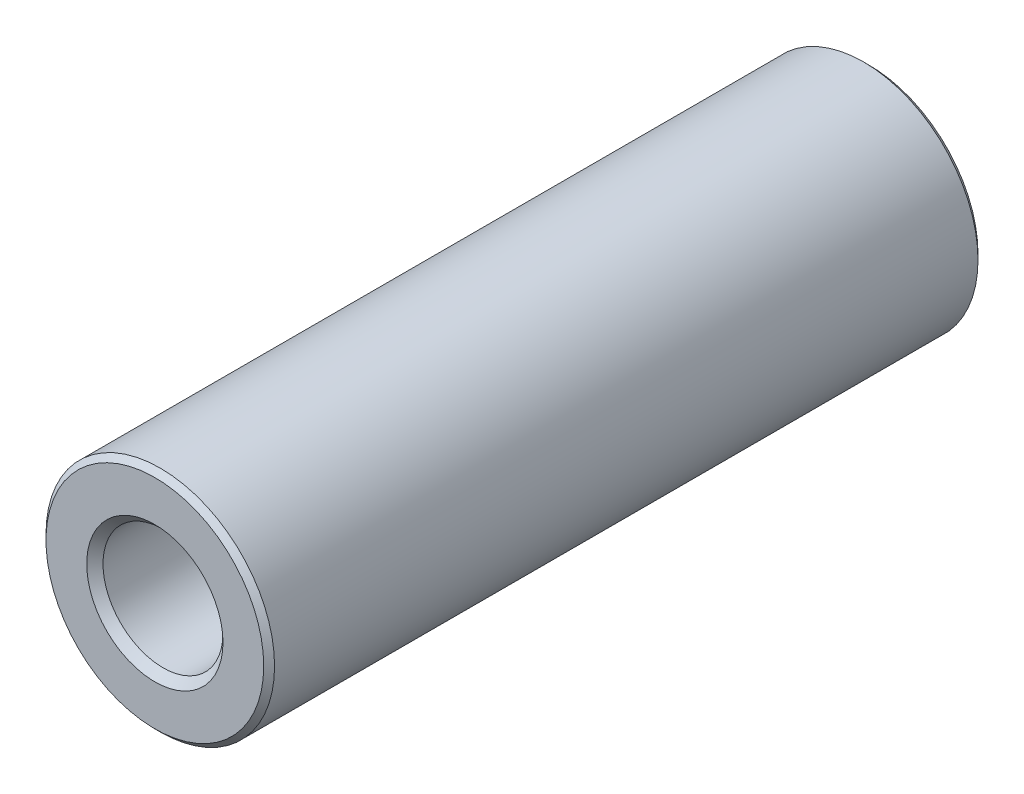
ISO-10303-21;
HEADER;
FILE_DESCRIPTION(('STEP AP214'),'2;1');
FILE_NAME('part.step','',(''),(''),'','','');
FILE_SCHEMA(('AUTOMOTIVE_DESIGN { 1 0 10303 214 1 1 1 1 }'));
ENDSEC;
DATA;
#1=APPLICATION_CONTEXT('core data for automotive mechanical design processes');
#2=APPLICATION_PROTOCOL_DEFINITION('international standard','automotive_design',2000,#1);
#3=PRODUCT_CONTEXT('',#1,'mechanical');
#4=PRODUCT('Part','Part','',(#3));
#5=PRODUCT_RELATED_PRODUCT_CATEGORY('part','',(#4));
#6=PRODUCT_DEFINITION_FORMATION('','',#4);
#7=PRODUCT_DEFINITION_CONTEXT('part definition',#1,'design');
#8=PRODUCT_DEFINITION('design','',#6,#7);
#9=PRODUCT_DEFINITION_SHAPE('','',#8);
#10=(LENGTH_UNIT() NAMED_UNIT(*) SI_UNIT(.MILLI.,.METRE.));
#11=(NAMED_UNIT(*) PLANE_ANGLE_UNIT() SI_UNIT($,.RADIAN.));
#12=(NAMED_UNIT(*) SI_UNIT($,.STERADIAN.) SOLID_ANGLE_UNIT());
#13=UNCERTAINTY_MEASURE_WITH_UNIT(LENGTH_MEASURE(1.E-05),#10,'distance_accuracy_value','');
#14=(GEOMETRIC_REPRESENTATION_CONTEXT(3) GLOBAL_UNCERTAINTY_ASSIGNED_CONTEXT((#13)) GLOBAL_UNIT_ASSIGNED_CONTEXT((#10,
#11,#12)) REPRESENTATION_CONTEXT('',''));
#15=CARTESIAN_POINT('',(0.,0.,0.));
#16=DIRECTION('',(0.,0.,1.));
#17=DIRECTION('',(1.,0.,0.));
#18=AXIS2_PLACEMENT_3D('',#15,#16,#17);
#19=CARTESIAN_POINT('',(0.,0.,-12.5));
#20=DIRECTION('',(0.,0.,1.));
#21=DIRECTION('',(1.,0.,0.));
#22=AXIS2_PLACEMENT_3D('',#19,#20,#21);
#23=CYLINDRICAL_SURFACE('',#22,4.);
#24=CARTESIAN_POINT('',(0.,0.,12.31));
#25=DIRECTION('',(0.,0.,1.));
#26=DIRECTION('',(1.,0.,0.));
#27=AXIS2_PLACEMENT_3D('',#24,#25,#26);
#28=CIRCLE('',#27,4.);
#29=CARTESIAN_POINT('',(4.,0.,12.31));
#30=VERTEX_POINT('',#29);
#31=EDGE_CURVE('E69',#30,#30,#28,.F.);
#32=ORIENTED_EDGE('',*,*,#31,.T.);
#33=EDGE_LOOP('',(#32));
#34=FACE_BOUND('',#33,.T.);
#35=CARTESIAN_POINT('',(0.,0.,-12.31));
#36=DIRECTION('',(0.,0.,1.));
#37=DIRECTION('',(1.,0.,0.));
#38=AXIS2_PLACEMENT_3D('',#35,#36,#37);
#39=CIRCLE('',#38,4.);
#40=CARTESIAN_POINT('',(4.,0.,-12.31));
#41=VERTEX_POINT('',#40);
#42=EDGE_CURVE('E73',#41,#41,#39,.T.);
#43=ORIENTED_EDGE('',*,*,#42,.T.);
#44=EDGE_LOOP('',(#43));
#45=FACE_BOUND('',#44,.T.);
#46=ADVANCED_FACE('F39',(#34,#45),#23,.T.);
#47=CARTESIAN_POINT('',(0.,0.,-12.5));
#48=DIRECTION('',(0.,0.,1.));
#49=DIRECTION('',(1.,0.,0.));
#50=AXIS2_PLACEMENT_3D('',#47,#48,#49);
#51=PLANE('',#50);
#52=CARTESIAN_POINT('',(0.,0.,-12.5));
#53=DIRECTION('',(0.,0.,1.));
#54=DIRECTION('',(1.,0.,0.));
#55=AXIS2_PLACEMENT_3D('',#52,#53,#54);
#56=CIRCLE('',#55,2.385);
#57=CARTESIAN_POINT('',(2.385,0.,-12.5));
#58=VERTEX_POINT('',#57);
#59=EDGE_CURVE('E10',#58,#58,#56,.T.);
#60=ORIENTED_EDGE('',*,*,#59,.T.);
#61=EDGE_LOOP('',(#60));
#62=FACE_BOUND('',#61,.T.);
#63=CARTESIAN_POINT('',(0.,0.,-12.5));
#64=DIRECTION('',(0.,0.,1.));
#65=DIRECTION('',(1.,0.,0.));
#66=AXIS2_PLACEMENT_3D('',#63,#64,#65);
#67=CIRCLE('',#66,3.81000000000001);
#68=CARTESIAN_POINT('',(3.81000000000001,0.,-12.5));
#69=VERTEX_POINT('',#68);
#70=EDGE_CURVE('E65',#69,#69,#67,.F.);
#71=ORIENTED_EDGE('',*,*,#70,.T.);
#72=EDGE_LOOP('',(#71));
#73=FACE_BOUND('',#72,.T.);
#74=ADVANCED_FACE('F102',(#62,#73),#51,.F.);
#75=CARTESIAN_POINT('',(0.,0.,-12.5));
#76=DIRECTION('',(0.,0.,1.));
#77=DIRECTION('',(1.,0.,0.));
#78=AXIS2_PLACEMENT_3D('',#75,#76,#77);
#79=CYLINDRICAL_SURFACE('',#78,2.1);
#80=CARTESIAN_POINT('',(0.,0.,12.215));
#81=DIRECTION('',(0.,0.,1.));
#82=DIRECTION('',(1.,0.,0.));
#83=AXIS2_PLACEMENT_3D('',#80,#81,#82);
#84=CIRCLE('',#83,2.1);
#85=CARTESIAN_POINT('',(2.1,0.,12.215));
#86=VERTEX_POINT('',#85);
#87=EDGE_CURVE('E53',#86,#86,#84,.T.);
#88=ORIENTED_EDGE('',*,*,#87,.T.);
#89=EDGE_LOOP('',(#88));
#90=FACE_BOUND('',#89,.T.);
#91=CARTESIAN_POINT('',(0.,0.,-12.215));
#92=DIRECTION('',(0.,0.,1.));
#93=DIRECTION('',(1.,0.,0.));
#94=AXIS2_PLACEMENT_3D('',#91,#92,#93);
#95=CIRCLE('',#94,2.1);
#96=CARTESIAN_POINT('',(2.1,0.,-12.215));
#97=VERTEX_POINT('',#96);
#98=EDGE_CURVE('E59',#97,#97,#95,.F.);
#99=ORIENTED_EDGE('',*,*,#98,.T.);
#100=EDGE_LOOP('',(#99));
#101=FACE_BOUND('',#100,.T.);
#102=ADVANCED_FACE('F97',(#90,#101),#79,.F.);
#103=CARTESIAN_POINT('',(0.,0.,12.5));
#104=DIRECTION('',(0.,0.,1.));
#105=DIRECTION('',(1.,0.,0.));
#106=AXIS2_PLACEMENT_3D('',#103,#104,#105);
#107=PLANE('',#106);
#108=CARTESIAN_POINT('',(0.,0.,12.5));
#109=DIRECTION('',(0.,0.,1.));
#110=DIRECTION('',(1.,0.,0.));
#111=AXIS2_PLACEMENT_3D('',#108,#109,#110);
#112=CIRCLE('',#111,2.385);
#113=CARTESIAN_POINT('',(2.385,0.,12.5));
#114=VERTEX_POINT('',#113);
#115=EDGE_CURVE('E47',#114,#114,#112,.F.);
#116=ORIENTED_EDGE('',*,*,#115,.T.);
#117=EDGE_LOOP('',(#116));
#118=FACE_BOUND('',#117,.T.);
#119=CARTESIAN_POINT('',(0.,0.,12.5));
#120=DIRECTION('',(0.,0.,1.));
#121=DIRECTION('',(1.,0.,0.));
#122=AXIS2_PLACEMENT_3D('',#119,#120,#121);
#123=CIRCLE('',#122,3.81);
#124=CARTESIAN_POINT('',(3.81,0.,12.5));
#125=VERTEX_POINT('',#124);
#126=EDGE_CURVE('E77',#125,#125,#123,.T.);
#127=ORIENTED_EDGE('',*,*,#126,.T.);
#128=EDGE_LOOP('',(#127));
#129=FACE_BOUND('',#128,.T.);
#130=ADVANCED_FACE('F83',(#118,#129),#107,.T.);
#131=CARTESIAN_POINT('',(0.,0.,12.5));
#132=DIRECTION('',(0.,0.,-1.));
#133=DIRECTION('',(-1.,0.,0.));
#134=AXIS2_PLACEMENT_3D('',#131,#132,#133);
#135=CONICAL_SURFACE('',#134,3.81,0.785398163397448);
#136=ORIENTED_EDGE('',*,*,#31,.F.);
#137=EDGE_LOOP('',(#136));
#138=FACE_BOUND('',#137,.T.);
#139=ORIENTED_EDGE('',*,*,#126,.F.);
#140=EDGE_LOOP('',(#139));
#141=FACE_BOUND('',#140,.T.);
#142=ADVANCED_FACE('F85',(#138,#141),#135,.T.);
#143=CARTESIAN_POINT('',(0.,0.,-12.31));
#144=DIRECTION('',(0.,0.,1.));
#145=DIRECTION('',(1.,0.,0.));
#146=AXIS2_PLACEMENT_3D('',#143,#144,#145);
#147=CONICAL_SURFACE('',#146,4.,0.785398163397444);
#148=ORIENTED_EDGE('',*,*,#70,.F.);
#149=EDGE_LOOP('',(#148));
#150=FACE_BOUND('',#149,.T.);
#151=ORIENTED_EDGE('',*,*,#42,.F.);
#152=EDGE_LOOP('',(#151));
#153=FACE_BOUND('',#152,.T.);
#154=ADVANCED_FACE('F87',(#150,#153),#147,.T.);
#155=CARTESIAN_POINT('',(0.,0.,12.215));
#156=DIRECTION('',(0.,0.,1.));
#157=DIRECTION('',(1.,0.,0.));
#158=AXIS2_PLACEMENT_3D('',#155,#156,#157);
#159=CONICAL_SURFACE('',#158,2.1,0.78539816339745);
#160=ORIENTED_EDGE('',*,*,#115,.F.);
#161=EDGE_LOOP('',(#160));
#162=FACE_BOUND('',#161,.T.);
#163=ORIENTED_EDGE('',*,*,#87,.F.);
#164=EDGE_LOOP('',(#163));
#165=FACE_BOUND('',#164,.T.);
#166=ADVANCED_FACE('F94',(#162,#165),#159,.F.);
#167=CARTESIAN_POINT('',(0.,0.,-12.5));
#168=DIRECTION('',(0.,0.,-1.));
#169=DIRECTION('',(-1.,0.,0.));
#170=AXIS2_PLACEMENT_3D('',#167,#168,#169);
#171=CONICAL_SURFACE('',#170,2.385,0.785398163397444);
#172=ORIENTED_EDGE('',*,*,#98,.F.);
#173=EDGE_LOOP('',(#172));
#174=FACE_BOUND('',#173,.T.);
#175=ORIENTED_EDGE('',*,*,#59,.F.);
#176=EDGE_LOOP('',(#175));
#177=FACE_BOUND('',#176,.T.);
#178=ADVANCED_FACE('F41',(#174,#177),#171,.F.);
#179=CLOSED_SHELL('',(#46,#74,#102,#130,#142,#154,#166,#178));
#180=MANIFOLD_SOLID_BREP('B2',#179);
#181=ADVANCED_BREP_SHAPE_REPRESENTATION('',(#18,#180),#14);
#182=SHAPE_DEFINITION_REPRESENTATION(#9,#181);
ENDSEC;
END-ISO-10303-21;
